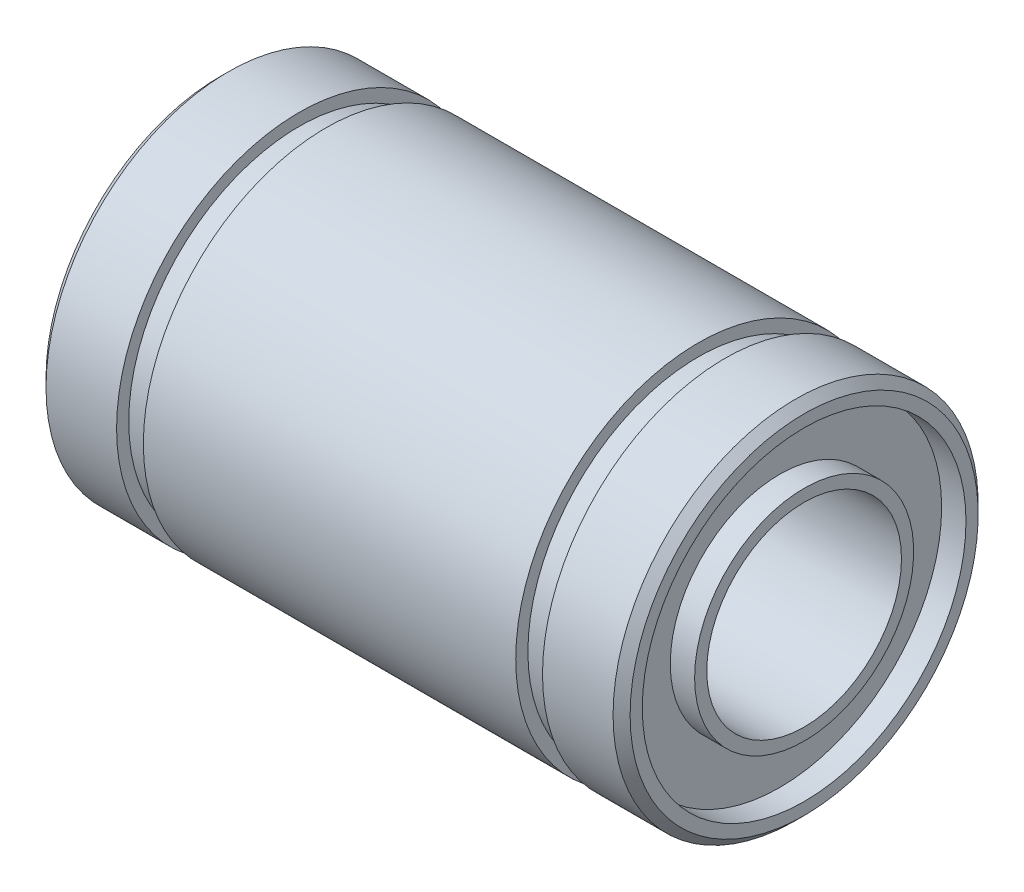
ISO-10303-21;
HEADER;
FILE_DESCRIPTION(('STEP AP214'),'2;1');
FILE_NAME('part.step','',(''),(''),'','','');
FILE_SCHEMA(('AUTOMOTIVE_DESIGN { 1 0 10303 214 1 1 1 1 }'));
ENDSEC;
DATA;
#1=APPLICATION_CONTEXT('core data for automotive mechanical design processes');
#2=APPLICATION_PROTOCOL_DEFINITION('international standard','automotive_design',2000,#1);
#3=PRODUCT_CONTEXT('',#1,'mechanical');
#4=PRODUCT('Part','Part','',(#3));
#5=PRODUCT_RELATED_PRODUCT_CATEGORY('part','',(#4));
#6=PRODUCT_DEFINITION_FORMATION('','',#4);
#7=PRODUCT_DEFINITION_CONTEXT('part definition',#1,'design');
#8=PRODUCT_DEFINITION('design','',#6,#7);
#9=PRODUCT_DEFINITION_SHAPE('','',#8);
#10=(LENGTH_UNIT() NAMED_UNIT(*) SI_UNIT(.MILLI.,.METRE.));
#11=(NAMED_UNIT(*) PLANE_ANGLE_UNIT() SI_UNIT($,.RADIAN.));
#12=(NAMED_UNIT(*) SI_UNIT($,.STERADIAN.) SOLID_ANGLE_UNIT());
#13=UNCERTAINTY_MEASURE_WITH_UNIT(LENGTH_MEASURE(1.E-05),#10,'distance_accuracy_value','');
#14=(GEOMETRIC_REPRESENTATION_CONTEXT(3) GLOBAL_UNCERTAINTY_ASSIGNED_CONTEXT((#13)) GLOBAL_UNIT_ASSIGNED_CONTEXT((#10,
#11,#12)) REPRESENTATION_CONTEXT('',''));
#15=CARTESIAN_POINT('',(0.,0.,0.));
#16=DIRECTION('',(0.,0.,1.));
#17=DIRECTION('',(1.,0.,0.));
#18=AXIS2_PLACEMENT_3D('',#15,#16,#17);
#19=CARTESIAN_POINT('',(11.65,0.,0.));
#20=DIRECTION('',(-1.,0.,0.));
#21=DIRECTION('',(0.,0.,1.));
#22=AXIS2_PLACEMENT_3D('',#19,#20,#21);
#23=CONICAL_SURFACE('',#22,7.5,0.78539816339745);
#24=CARTESIAN_POINT('',(12.,0.,0.));
#25=DIRECTION('',(-1.,0.,0.));
#26=DIRECTION('',(0.,0.,1.));
#27=AXIS2_PLACEMENT_3D('',#24,#25,#26);
#28=CIRCLE('',#27,7.15);
#29=CARTESIAN_POINT('',(12.,0.,7.15));
#30=VERTEX_POINT('',#29);
#31=EDGE_CURVE('E104',#30,#30,#28,.T.);
#32=ORIENTED_EDGE('',*,*,#31,.T.);
#33=EDGE_LOOP('',(#32));
#34=FACE_BOUND('',#33,.T.);
#35=CARTESIAN_POINT('',(11.65,0.,0.));
#36=DIRECTION('',(-1.,0.,0.));
#37=DIRECTION('',(0.,0.,1.));
#38=AXIS2_PLACEMENT_3D('',#35,#36,#37);
#39=CIRCLE('',#38,7.5);
#40=CARTESIAN_POINT('',(11.65,0.,7.5));
#41=VERTEX_POINT('',#40);
#42=EDGE_CURVE('E10',#41,#41,#39,.T.);
#43=ORIENTED_EDGE('',*,*,#42,.F.);
#44=EDGE_LOOP('',(#43));
#45=FACE_BOUND('',#44,.T.);
#46=ADVANCED_FACE('F34',(#34,#45),#23,.T.);
#47=CARTESIAN_POINT('',(-45.6895053247726,0.,0.));
#48=DIRECTION('',(-1.,0.,0.));
#49=DIRECTION('',(0.,0.,1.));
#50=AXIS2_PLACEMENT_3D('',#47,#48,#49);
#51=CYLINDRICAL_SURFACE('',#50,7.5);
#52=CARTESIAN_POINT('',(8.75000000000001,0.,0.));
#53=DIRECTION('',(-1.,0.,0.));
#54=DIRECTION('',(0.,0.,1.));
#55=AXIS2_PLACEMENT_3D('',#52,#53,#54);
#56=CIRCLE('',#55,7.5);
#57=CARTESIAN_POINT('',(8.75000000000001,0.,7.5));
#58=VERTEX_POINT('',#57);
#59=EDGE_CURVE('E40',#58,#58,#56,.T.);
#60=ORIENTED_EDGE('',*,*,#59,.F.);
#61=EDGE_LOOP('',(#60));
#62=FACE_BOUND('',#61,.T.);
#63=ORIENTED_EDGE('',*,*,#42,.T.);
#64=EDGE_LOOP('',(#63));
#65=FACE_BOUND('',#64,.T.);
#66=ADVANCED_FACE('F122',(#62,#65),#51,.T.);
#67=CARTESIAN_POINT('',(8.75000000000001,0.,0.));
#68=DIRECTION('',(1.,0.,0.));
#69=DIRECTION('',(0.,0.,-1.));
#70=AXIS2_PLACEMENT_3D('',#67,#68,#69);
#71=PLANE('',#70);
#72=CARTESIAN_POINT('',(8.75000000000001,0.,0.));
#73=DIRECTION('',(-1.,0.,0.));
#74=DIRECTION('',(0.,0.,1.));
#75=AXIS2_PLACEMENT_3D('',#72,#73,#74);
#76=CIRCLE('',#75,7.);
#77=CARTESIAN_POINT('',(8.75000000000001,0.,7.));
#78=VERTEX_POINT('',#77);
#79=EDGE_CURVE('E44',#78,#78,#76,.T.);
#80=ORIENTED_EDGE('',*,*,#79,.F.);
#81=EDGE_LOOP('',(#80));
#82=FACE_BOUND('',#81,.T.);
#83=ORIENTED_EDGE('',*,*,#59,.T.);
#84=EDGE_LOOP('',(#83));
#85=FACE_BOUND('',#84,.T.);
#86=ADVANCED_FACE('F126',(#82,#85),#71,.F.);
#87=CARTESIAN_POINT('',(-45.6895053247726,0.,0.));
#88=DIRECTION('',(-1.,0.,0.));
#89=DIRECTION('',(0.,0.,1.));
#90=AXIS2_PLACEMENT_3D('',#87,#88,#89);
#91=CYLINDRICAL_SURFACE('',#90,7.);
#92=CARTESIAN_POINT('',(7.65,0.,0.));
#93=DIRECTION('',(-1.,0.,0.));
#94=DIRECTION('',(0.,0.,1.));
#95=AXIS2_PLACEMENT_3D('',#92,#93,#94);
#96=CIRCLE('',#95,7.);
#97=CARTESIAN_POINT('',(7.65,0.,7.));
#98=VERTEX_POINT('',#97);
#99=EDGE_CURVE('E48',#98,#98,#96,.T.);
#100=ORIENTED_EDGE('',*,*,#99,.F.);
#101=EDGE_LOOP('',(#100));
#102=FACE_BOUND('',#101,.T.);
#103=ORIENTED_EDGE('',*,*,#79,.T.);
#104=EDGE_LOOP('',(#103));
#105=FACE_BOUND('',#104,.T.);
#106=ADVANCED_FACE('F131',(#102,#105),#91,.T.);
#107=CARTESIAN_POINT('',(7.65,0.,0.));
#108=DIRECTION('',(-1.,0.,0.));
#109=DIRECTION('',(0.,0.,1.));
#110=AXIS2_PLACEMENT_3D('',#107,#108,#109);
#111=PLANE('',#110);
#112=CARTESIAN_POINT('',(7.65,0.,0.));
#113=DIRECTION('',(-1.,0.,0.));
#114=DIRECTION('',(0.,0.,1.));
#115=AXIS2_PLACEMENT_3D('',#112,#113,#114);
#116=CIRCLE('',#115,7.5);
#117=CARTESIAN_POINT('',(7.65,0.,7.5));
#118=VERTEX_POINT('',#117);
#119=EDGE_CURVE('E53',#118,#118,#116,.T.);
#120=ORIENTED_EDGE('',*,*,#119,.F.);
#121=EDGE_LOOP('',(#120));
#122=FACE_BOUND('',#121,.T.);
#123=ORIENTED_EDGE('',*,*,#99,.T.);
#124=EDGE_LOOP('',(#123));
#125=FACE_BOUND('',#124,.T.);
#126=ADVANCED_FACE('F137',(#122,#125),#111,.F.);
#127=CARTESIAN_POINT('',(-45.6895053247726,0.,0.));
#128=DIRECTION('',(-1.,0.,0.));
#129=DIRECTION('',(0.,0.,1.));
#130=AXIS2_PLACEMENT_3D('',#127,#128,#129);
#131=CYLINDRICAL_SURFACE('',#130,7.5);
#132=ORIENTED_EDGE('',*,*,#119,.T.);
#133=EDGE_LOOP('',(#132));
#134=FACE_BOUND('',#133,.T.);
#135=CARTESIAN_POINT('',(-7.65,0.,0.));
#136=DIRECTION('',(-1.,0.,0.));
#137=DIRECTION('',(0.,0.,1.));
#138=AXIS2_PLACEMENT_3D('',#135,#136,#137);
#139=CIRCLE('',#138,7.5);
#140=CARTESIAN_POINT('',(-7.65,0.,7.5));
#141=VERTEX_POINT('',#140);
#142=EDGE_CURVE('E56',#141,#141,#139,.T.);
#143=ORIENTED_EDGE('',*,*,#142,.F.);
#144=EDGE_LOOP('',(#143));
#145=FACE_BOUND('',#144,.T.);
#146=ADVANCED_FACE('F141',(#134,#145),#131,.T.);
#147=CARTESIAN_POINT('',(-7.65,0.,0.));
#148=DIRECTION('',(-1.,0.,0.));
#149=DIRECTION('',(0.,0.,1.));
#150=AXIS2_PLACEMENT_3D('',#147,#148,#149);
#151=PLANE('',#150);
#152=ORIENTED_EDGE('',*,*,#142,.T.);
#153=EDGE_LOOP('',(#152));
#154=FACE_BOUND('',#153,.T.);
#155=CARTESIAN_POINT('',(-7.65,0.,0.));
#156=DIRECTION('',(-1.,0.,0.));
#157=DIRECTION('',(0.,0.,1.));
#158=AXIS2_PLACEMENT_3D('',#155,#156,#157);
#159=CIRCLE('',#158,7.);
#160=CARTESIAN_POINT('',(-7.65,0.,7.));
#161=VERTEX_POINT('',#160);
#162=EDGE_CURVE('E59',#161,#161,#159,.T.);
#163=ORIENTED_EDGE('',*,*,#162,.F.);
#164=EDGE_LOOP('',(#163));
#165=FACE_BOUND('',#164,.T.);
#166=ADVANCED_FACE('F145',(#154,#165),#151,.T.);
#167=CARTESIAN_POINT('',(-45.6895053247726,0.,0.));
#168=DIRECTION('',(-1.,0.,0.));
#169=DIRECTION('',(0.,0.,1.));
#170=AXIS2_PLACEMENT_3D('',#167,#168,#169);
#171=CYLINDRICAL_SURFACE('',#170,7.);
#172=ORIENTED_EDGE('',*,*,#162,.T.);
#173=EDGE_LOOP('',(#172));
#174=FACE_BOUND('',#173,.T.);
#175=CARTESIAN_POINT('',(-8.74999999999999,0.,0.));
#176=DIRECTION('',(-1.,0.,0.));
#177=DIRECTION('',(0.,0.,1.));
#178=AXIS2_PLACEMENT_3D('',#175,#176,#177);
#179=CIRCLE('',#178,7.);
#180=CARTESIAN_POINT('',(-8.74999999999999,0.,7.));
#181=VERTEX_POINT('',#180);
#182=EDGE_CURVE('E62',#181,#181,#179,.T.);
#183=ORIENTED_EDGE('',*,*,#182,.F.);
#184=EDGE_LOOP('',(#183));
#185=FACE_BOUND('',#184,.T.);
#186=ADVANCED_FACE('F149',(#174,#185),#171,.T.);
#187=CARTESIAN_POINT('',(-8.75,0.,0.));
#188=DIRECTION('',(1.,0.,0.));
#189=DIRECTION('',(0.,0.,-1.));
#190=AXIS2_PLACEMENT_3D('',#187,#188,#189);
#191=PLANE('',#190);
#192=ORIENTED_EDGE('',*,*,#182,.T.);
#193=EDGE_LOOP('',(#192));
#194=FACE_BOUND('',#193,.T.);
#195=CARTESIAN_POINT('',(-8.74999999999999,0.,0.));
#196=DIRECTION('',(-1.,0.,0.));
#197=DIRECTION('',(0.,0.,1.));
#198=AXIS2_PLACEMENT_3D('',#195,#196,#197);
#199=CIRCLE('',#198,7.5);
#200=CARTESIAN_POINT('',(-8.74999999999999,0.,7.5));
#201=VERTEX_POINT('',#200);
#202=EDGE_CURVE('E65',#201,#201,#199,.T.);
#203=ORIENTED_EDGE('',*,*,#202,.F.);
#204=EDGE_LOOP('',(#203));
#205=FACE_BOUND('',#204,.T.);
#206=ADVANCED_FACE('F153',(#194,#205),#191,.T.);
#207=CARTESIAN_POINT('',(-45.6895053247726,0.,0.));
#208=DIRECTION('',(-1.,0.,0.));
#209=DIRECTION('',(0.,0.,1.));
#210=AXIS2_PLACEMENT_3D('',#207,#208,#209);
#211=CYLINDRICAL_SURFACE('',#210,7.5);
#212=ORIENTED_EDGE('',*,*,#202,.T.);
#213=EDGE_LOOP('',(#212));
#214=FACE_BOUND('',#213,.T.);
#215=CARTESIAN_POINT('',(-11.65,0.,0.));
#216=DIRECTION('',(-1.,0.,0.));
#217=DIRECTION('',(0.,0.,1.));
#218=AXIS2_PLACEMENT_3D('',#215,#216,#217);
#219=CIRCLE('',#218,7.5);
#220=CARTESIAN_POINT('',(-11.65,0.,7.5));
#221=VERTEX_POINT('',#220);
#222=EDGE_CURVE('E68',#221,#221,#219,.T.);
#223=ORIENTED_EDGE('',*,*,#222,.F.);
#224=EDGE_LOOP('',(#223));
#225=FACE_BOUND('',#224,.T.);
#226=ADVANCED_FACE('F157',(#214,#225),#211,.T.);
#227=CARTESIAN_POINT('',(-11.65,0.,0.));
#228=DIRECTION('',(1.,0.,0.));
#229=DIRECTION('',(0.,0.,-1.));
#230=AXIS2_PLACEMENT_3D('',#227,#228,#229);
#231=CONICAL_SURFACE('',#230,7.5,0.78539816339745);
#232=CARTESIAN_POINT('',(-12.,0.,0.));
#233=DIRECTION('',(-1.,0.,0.));
#234=DIRECTION('',(0.,0.,1.));
#235=AXIS2_PLACEMENT_3D('',#232,#233,#234);
#236=CIRCLE('',#235,7.15);
#237=CARTESIAN_POINT('',(-12.,0.,7.15));
#238=VERTEX_POINT('',#237);
#239=EDGE_CURVE('E71',#238,#238,#236,.T.);
#240=ORIENTED_EDGE('',*,*,#239,.F.);
#241=EDGE_LOOP('',(#240));
#242=FACE_BOUND('',#241,.T.);
#243=ORIENTED_EDGE('',*,*,#222,.T.);
#244=EDGE_LOOP('',(#243));
#245=FACE_BOUND('',#244,.T.);
#246=ADVANCED_FACE('F161',(#242,#245),#231,.T.);
#247=CARTESIAN_POINT('',(-12.,0.,0.));
#248=DIRECTION('',(1.,0.,0.));
#249=DIRECTION('',(0.,0.,-1.));
#250=AXIS2_PLACEMENT_3D('',#247,#248,#249);
#251=PLANE('',#250);
#252=CARTESIAN_POINT('',(-12.,0.,0.));
#253=DIRECTION('',(-1.,0.,0.));
#254=DIRECTION('',(0.,0.,1.));
#255=AXIS2_PLACEMENT_3D('',#252,#253,#254);
#256=CIRCLE('',#255,6.65);
#257=CARTESIAN_POINT('',(-12.,0.,6.65));
#258=VERTEX_POINT('',#257);
#259=EDGE_CURVE('E74',#258,#258,#256,.T.);
#260=ORIENTED_EDGE('',*,*,#259,.F.);
#261=EDGE_LOOP('',(#260));
#262=FACE_BOUND('',#261,.T.);
#263=ORIENTED_EDGE('',*,*,#239,.T.);
#264=EDGE_LOOP('',(#263));
#265=FACE_BOUND('',#264,.T.);
#266=ADVANCED_FACE('F165',(#262,#265),#251,.F.);
#267=CARTESIAN_POINT('',(-45.6895053247726,0.,0.));
#268=DIRECTION('',(-1.,0.,0.));
#269=DIRECTION('',(0.,0.,1.));
#270=AXIS2_PLACEMENT_3D('',#267,#268,#269);
#271=CYLINDRICAL_SURFACE('',#270,6.65);
#272=CARTESIAN_POINT('',(-11.,0.,0.));
#273=DIRECTION('',(-1.,0.,0.));
#274=DIRECTION('',(0.,0.,1.));
#275=AXIS2_PLACEMENT_3D('',#272,#273,#274);
#276=CIRCLE('',#275,6.65);
#277=CARTESIAN_POINT('',(-11.,0.,6.65));
#278=VERTEX_POINT('',#277);
#279=EDGE_CURVE('E77',#278,#278,#276,.T.);
#280=ORIENTED_EDGE('',*,*,#279,.F.);
#281=EDGE_LOOP('',(#280));
#282=FACE_BOUND('',#281,.T.);
#283=ORIENTED_EDGE('',*,*,#259,.T.);
#284=EDGE_LOOP('',(#283));
#285=FACE_BOUND('',#284,.T.);
#286=ADVANCED_FACE('F169',(#282,#285),#271,.F.);
#287=CARTESIAN_POINT('',(-11.,0.,0.));
#288=DIRECTION('',(1.,0.,0.));
#289=DIRECTION('',(0.,0.,-1.));
#290=AXIS2_PLACEMENT_3D('',#287,#288,#289);
#291=PLANE('',#290);
#292=CARTESIAN_POINT('',(-11.,0.,0.));
#293=DIRECTION('',(-1.,0.,0.));
#294=DIRECTION('',(0.,0.,1.));
#295=AXIS2_PLACEMENT_3D('',#292,#293,#294);
#296=CIRCLE('',#295,4.5);
#297=CARTESIAN_POINT('',(-11.,0.,4.5));
#298=VERTEX_POINT('',#297);
#299=EDGE_CURVE('E80',#298,#298,#296,.T.);
#300=ORIENTED_EDGE('',*,*,#299,.F.);
#301=EDGE_LOOP('',(#300));
#302=FACE_BOUND('',#301,.T.);
#303=ORIENTED_EDGE('',*,*,#279,.T.);
#304=EDGE_LOOP('',(#303));
#305=FACE_BOUND('',#304,.T.);
#306=ADVANCED_FACE('F173',(#302,#305),#291,.F.);
#307=CARTESIAN_POINT('',(-45.6895053247726,0.,0.));
#308=DIRECTION('',(-1.,0.,0.));
#309=DIRECTION('',(0.,0.,1.));
#310=AXIS2_PLACEMENT_3D('',#307,#308,#309);
#311=CYLINDRICAL_SURFACE('',#310,4.5);
#312=CARTESIAN_POINT('',(-12.,0.,0.));
#313=DIRECTION('',(-1.,0.,0.));
#314=DIRECTION('',(0.,0.,1.));
#315=AXIS2_PLACEMENT_3D('',#312,#313,#314);
#316=CIRCLE('',#315,4.5);
#317=CARTESIAN_POINT('',(-12.,0.,4.5));
#318=VERTEX_POINT('',#317);
#319=EDGE_CURVE('E83',#318,#318,#316,.T.);
#320=ORIENTED_EDGE('',*,*,#319,.F.);
#321=EDGE_LOOP('',(#320));
#322=FACE_BOUND('',#321,.T.);
#323=ORIENTED_EDGE('',*,*,#299,.T.);
#324=EDGE_LOOP('',(#323));
#325=FACE_BOUND('',#324,.T.);
#326=ADVANCED_FACE('F177',(#322,#325),#311,.T.);
#327=CARTESIAN_POINT('',(-12.,0.,0.));
#328=DIRECTION('',(1.,0.,0.));
#329=DIRECTION('',(0.,0.,-1.));
#330=AXIS2_PLACEMENT_3D('',#327,#328,#329);
#331=PLANE('',#330);
#332=CARTESIAN_POINT('',(-12.,0.,0.));
#333=DIRECTION('',(-1.,0.,0.));
#334=DIRECTION('',(0.,0.,1.));
#335=AXIS2_PLACEMENT_3D('',#332,#333,#334);
#336=CIRCLE('',#335,4.);
#337=CARTESIAN_POINT('',(-12.,0.,4.));
#338=VERTEX_POINT('',#337);
#339=EDGE_CURVE('E86',#338,#338,#336,.T.);
#340=ORIENTED_EDGE('',*,*,#339,.F.);
#341=EDGE_LOOP('',(#340));
#342=FACE_BOUND('',#341,.T.);
#343=ORIENTED_EDGE('',*,*,#319,.T.);
#344=EDGE_LOOP('',(#343));
#345=FACE_BOUND('',#344,.T.);
#346=ADVANCED_FACE('F181',(#342,#345),#331,.F.);
#347=CARTESIAN_POINT('',(-45.6895053247726,0.,0.));
#348=DIRECTION('',(-1.,0.,0.));
#349=DIRECTION('',(0.,0.,1.));
#350=AXIS2_PLACEMENT_3D('',#347,#348,#349);
#351=CYLINDRICAL_SURFACE('',#350,4.);
#352=CARTESIAN_POINT('',(12.,0.,0.));
#353=DIRECTION('',(-1.,0.,0.));
#354=DIRECTION('',(0.,0.,1.));
#355=AXIS2_PLACEMENT_3D('',#352,#353,#354);
#356=CIRCLE('',#355,4.);
#357=CARTESIAN_POINT('',(12.,0.,4.));
#358=VERTEX_POINT('',#357);
#359=EDGE_CURVE('E89',#358,#358,#356,.T.);
#360=ORIENTED_EDGE('',*,*,#359,.F.);
#361=EDGE_LOOP('',(#360));
#362=FACE_BOUND('',#361,.T.);
#363=ORIENTED_EDGE('',*,*,#339,.T.);
#364=EDGE_LOOP('',(#363));
#365=FACE_BOUND('',#364,.T.);
#366=ADVANCED_FACE('F185',(#362,#365),#351,.F.);
#367=CARTESIAN_POINT('',(12.,0.,0.));
#368=DIRECTION('',(1.,0.,0.));
#369=DIRECTION('',(0.,0.,-1.));
#370=AXIS2_PLACEMENT_3D('',#367,#368,#369);
#371=PLANE('',#370);
#372=ORIENTED_EDGE('',*,*,#359,.T.);
#373=EDGE_LOOP('',(#372));
#374=FACE_BOUND('',#373,.T.);
#375=CARTESIAN_POINT('',(12.,0.,0.));
#376=DIRECTION('',(-1.,0.,0.));
#377=DIRECTION('',(0.,0.,1.));
#378=AXIS2_PLACEMENT_3D('',#375,#376,#377);
#379=CIRCLE('',#378,4.5);
#380=CARTESIAN_POINT('',(12.,0.,4.5));
#381=VERTEX_POINT('',#380);
#382=EDGE_CURVE('E92',#381,#381,#379,.T.);
#383=ORIENTED_EDGE('',*,*,#382,.F.);
#384=EDGE_LOOP('',(#383));
#385=FACE_BOUND('',#384,.T.);
#386=ADVANCED_FACE('F189',(#374,#385),#371,.T.);
#387=CARTESIAN_POINT('',(-45.6895053247726,0.,0.));
#388=DIRECTION('',(-1.,0.,0.));
#389=DIRECTION('',(0.,0.,1.));
#390=AXIS2_PLACEMENT_3D('',#387,#388,#389);
#391=CYLINDRICAL_SURFACE('',#390,4.5);
#392=ORIENTED_EDGE('',*,*,#382,.T.);
#393=EDGE_LOOP('',(#392));
#394=FACE_BOUND('',#393,.T.);
#395=CARTESIAN_POINT('',(11.,0.,0.));
#396=DIRECTION('',(-1.,0.,0.));
#397=DIRECTION('',(0.,0.,1.));
#398=AXIS2_PLACEMENT_3D('',#395,#396,#397);
#399=CIRCLE('',#398,4.5);
#400=CARTESIAN_POINT('',(11.,0.,4.5));
#401=VERTEX_POINT('',#400);
#402=EDGE_CURVE('E95',#401,#401,#399,.T.);
#403=ORIENTED_EDGE('',*,*,#402,.F.);
#404=EDGE_LOOP('',(#403));
#405=FACE_BOUND('',#404,.T.);
#406=ADVANCED_FACE('F193',(#394,#405),#391,.T.);
#407=CARTESIAN_POINT('',(11.,0.,0.));
#408=DIRECTION('',(1.,0.,0.));
#409=DIRECTION('',(0.,0.,-1.));
#410=AXIS2_PLACEMENT_3D('',#407,#408,#409);
#411=PLANE('',#410);
#412=ORIENTED_EDGE('',*,*,#402,.T.);
#413=EDGE_LOOP('',(#412));
#414=FACE_BOUND('',#413,.T.);
#415=CARTESIAN_POINT('',(11.,0.,0.));
#416=DIRECTION('',(-1.,0.,0.));
#417=DIRECTION('',(0.,0.,1.));
#418=AXIS2_PLACEMENT_3D('',#415,#416,#417);
#419=CIRCLE('',#418,6.65);
#420=CARTESIAN_POINT('',(11.,0.,6.65));
#421=VERTEX_POINT('',#420);
#422=EDGE_CURVE('E98',#421,#421,#419,.T.);
#423=ORIENTED_EDGE('',*,*,#422,.F.);
#424=EDGE_LOOP('',(#423));
#425=FACE_BOUND('',#424,.T.);
#426=ADVANCED_FACE('F118',(#414,#425),#411,.T.);
#427=CARTESIAN_POINT('',(-45.6895053247726,0.,0.));
#428=DIRECTION('',(-1.,0.,0.));
#429=DIRECTION('',(0.,0.,1.));
#430=AXIS2_PLACEMENT_3D('',#427,#428,#429);
#431=CYLINDRICAL_SURFACE('',#430,6.65);
#432=ORIENTED_EDGE('',*,*,#422,.T.);
#433=EDGE_LOOP('',(#432));
#434=FACE_BOUND('',#433,.T.);
#435=CARTESIAN_POINT('',(12.,0.,0.));
#436=DIRECTION('',(-1.,0.,0.));
#437=DIRECTION('',(0.,0.,1.));
#438=AXIS2_PLACEMENT_3D('',#435,#436,#437);
#439=CIRCLE('',#438,6.65);
#440=CARTESIAN_POINT('',(12.,0.,6.65));
#441=VERTEX_POINT('',#440);
#442=EDGE_CURVE('E101',#441,#441,#439,.T.);
#443=ORIENTED_EDGE('',*,*,#442,.F.);
#444=EDGE_LOOP('',(#443));
#445=FACE_BOUND('',#444,.T.);
#446=ADVANCED_FACE('F112',(#434,#445),#431,.F.);
#447=CARTESIAN_POINT('',(12.,0.,0.));
#448=DIRECTION('',(1.,0.,0.));
#449=DIRECTION('',(0.,0.,-1.));
#450=AXIS2_PLACEMENT_3D('',#447,#448,#449);
#451=PLANE('',#450);
#452=ORIENTED_EDGE('',*,*,#442,.T.);
#453=EDGE_LOOP('',(#452));
#454=FACE_BOUND('',#453,.T.);
#455=ORIENTED_EDGE('',*,*,#31,.F.);
#456=EDGE_LOOP('',(#455));
#457=FACE_BOUND('',#456,.T.);
#458=ADVANCED_FACE('F110',(#454,#457),#451,.T.);
#459=CLOSED_SHELL('',(#46,#66,#86,#106,#126,#146,#166,#186,#206,#226,#246,#266,#286,#306,#326,
#346,#366,#386,#406,#426,#446,#458));
#460=MANIFOLD_SOLID_BREP('B2',#459);
#461=ADVANCED_BREP_SHAPE_REPRESENTATION('',(#18,#460),#14);
#462=SHAPE_DEFINITION_REPRESENTATION(#9,#461);
ENDSEC;
END-ISO-10303-21;
